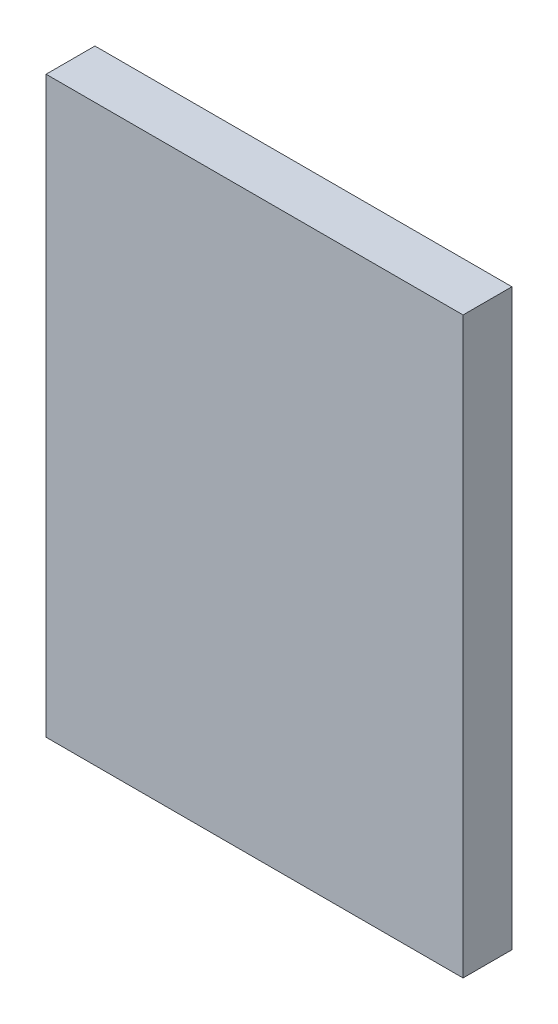
ISO-10303-21;
HEADER;
FILE_DESCRIPTION(('STEP AP214'),'2;1');
FILE_NAME('part.step','',(''),(''),'','','');
FILE_SCHEMA(('AUTOMOTIVE_DESIGN { 1 0 10303 214 1 1 1 1 }'));
ENDSEC;
DATA;
#1=APPLICATION_CONTEXT('core data for automotive mechanical design processes');
#2=APPLICATION_PROTOCOL_DEFINITION('international standard','automotive_design',2000,#1);
#3=PRODUCT_CONTEXT('',#1,'mechanical');
#4=PRODUCT('Part','Part','',(#3));
#5=PRODUCT_RELATED_PRODUCT_CATEGORY('part','',(#4));
#6=PRODUCT_DEFINITION_FORMATION('','',#4);
#7=PRODUCT_DEFINITION_CONTEXT('part definition',#1,'design');
#8=PRODUCT_DEFINITION('design','',#6,#7);
#9=PRODUCT_DEFINITION_SHAPE('','',#8);
#10=(LENGTH_UNIT() NAMED_UNIT(*) SI_UNIT(.MILLI.,.METRE.));
#11=(NAMED_UNIT(*) PLANE_ANGLE_UNIT() SI_UNIT($,.RADIAN.));
#12=(NAMED_UNIT(*) SI_UNIT($,.STERADIAN.) SOLID_ANGLE_UNIT());
#13=UNCERTAINTY_MEASURE_WITH_UNIT(LENGTH_MEASURE(1.E-05),#10,'distance_accuracy_value','');
#14=(GEOMETRIC_REPRESENTATION_CONTEXT(3) GLOBAL_UNCERTAINTY_ASSIGNED_CONTEXT((#13)) GLOBAL_UNIT_ASSIGNED_CONTEXT((#10,
#11,#12)) REPRESENTATION_CONTEXT('',''));
#15=CARTESIAN_POINT('',(0.,0.,0.));
#16=DIRECTION('',(0.,0.,1.));
#17=DIRECTION('',(1.,0.,0.));
#18=AXIS2_PLACEMENT_3D('',#15,#16,#17);
#19=CARTESIAN_POINT('',(-17.5,22.4,-2.));
#20=DIRECTION('',(-1.,0.,0.));
#21=DIRECTION('',(0.,0.,1.));
#22=AXIS2_PLACEMENT_3D('',#19,#20,#21);
#23=PLANE('',#22);
#24=DIRECTION('',(0.,-1.,0.));
#25=VECTOR('',#24,1.);
#26=CARTESIAN_POINT('',(-17.5,22.4,2.1));
#27=LINE('',#26,#25);
#28=CARTESIAN_POINT('',(-17.5,22.4,2.1));
#29=VERTEX_POINT('',#28);
#30=CARTESIAN_POINT('',(-17.5,-25.8,2.1));
#31=VERTEX_POINT('',#30);
#32=EDGE_CURVE('E104',#29,#31,#27,.T.);
#33=ORIENTED_EDGE('',*,*,#32,.F.);
#34=DIRECTION('',(0.,0.,1.));
#35=VECTOR('',#34,1.);
#36=CARTESIAN_POINT('',(-17.5,22.4,-2.));
#37=LINE('',#36,#35);
#38=CARTESIAN_POINT('',(-17.5,22.4,-2.));
#39=VERTEX_POINT('',#38);
#40=EDGE_CURVE('E11',#39,#29,#37,.T.);
#41=ORIENTED_EDGE('',*,*,#40,.F.);
#42=DIRECTION('',(0.,-1.,0.));
#43=VECTOR('',#42,1.);
#44=CARTESIAN_POINT('',(-17.5,22.4,-2.));
#45=LINE('',#44,#43);
#46=CARTESIAN_POINT('',(-17.5,-25.8,-2.));
#47=VERTEX_POINT('',#46);
#48=EDGE_CURVE('E100',#39,#47,#45,.T.);
#49=ORIENTED_EDGE('',*,*,#48,.T.);
#50=DIRECTION('',(0.,0.,1.));
#51=VECTOR('',#50,1.);
#52=CARTESIAN_POINT('',(-17.5,-25.8,-2.));
#53=LINE('',#52,#51);
#54=EDGE_CURVE('E45',#47,#31,#53,.T.);
#55=ORIENTED_EDGE('',*,*,#54,.T.);
#56=EDGE_LOOP('',(#33,#41,#49,#55));
#57=FACE_BOUND('',#56,.T.);
#58=ADVANCED_FACE('F39',(#57),#23,.T.);
#59=CARTESIAN_POINT('',(17.5,22.4,-2.));
#60=DIRECTION('',(0.,1.,0.));
#61=DIRECTION('',(0.,0.,1.));
#62=AXIS2_PLACEMENT_3D('',#59,#60,#61);
#63=PLANE('',#62);
#64=DIRECTION('',(-1.,0.,0.));
#65=VECTOR('',#64,1.);
#66=CARTESIAN_POINT('',(17.5,22.4,2.1));
#67=LINE('',#66,#65);
#68=CARTESIAN_POINT('',(17.5,22.4,2.1));
#69=VERTEX_POINT('',#68);
#70=EDGE_CURVE('E98',#69,#29,#67,.T.);
#71=ORIENTED_EDGE('',*,*,#70,.F.);
#72=DIRECTION('',(0.,0.,1.));
#73=VECTOR('',#72,1.);
#74=CARTESIAN_POINT('',(17.5,22.4,-2.));
#75=LINE('',#74,#73);
#76=CARTESIAN_POINT('',(17.5,22.4,-2.));
#77=VERTEX_POINT('',#76);
#78=EDGE_CURVE('E48',#77,#69,#75,.T.);
#79=ORIENTED_EDGE('',*,*,#78,.F.);
#80=DIRECTION('',(-1.,0.,0.));
#81=VECTOR('',#80,1.);
#82=CARTESIAN_POINT('',(17.5,22.4,-2.));
#83=LINE('',#82,#81);
#84=EDGE_CURVE('E92',#77,#39,#83,.T.);
#85=ORIENTED_EDGE('',*,*,#84,.T.);
#86=ORIENTED_EDGE('',*,*,#40,.T.);
#87=EDGE_LOOP('',(#71,#79,#85,#86));
#88=FACE_BOUND('',#87,.T.);
#89=ADVANCED_FACE('F111',(#88),#63,.T.);
#90=CARTESIAN_POINT('',(17.5,-25.8,-2.));
#91=DIRECTION('',(1.,0.,0.));
#92=DIRECTION('',(0.,0.,-1.));
#93=AXIS2_PLACEMENT_3D('',#90,#91,#92);
#94=PLANE('',#93);
#95=DIRECTION('',(0.,1.,0.));
#96=VECTOR('',#95,1.);
#97=CARTESIAN_POINT('',(17.5,-25.8,2.1));
#98=LINE('',#97,#96);
#99=CARTESIAN_POINT('',(17.5,-25.8,2.1));
#100=VERTEX_POINT('',#99);
#101=EDGE_CURVE('E87',#100,#69,#98,.T.);
#102=ORIENTED_EDGE('',*,*,#101,.F.);
#103=DIRECTION('',(0.,0.,1.));
#104=VECTOR('',#103,1.);
#105=CARTESIAN_POINT('',(17.5,-25.8,-2.));
#106=LINE('',#105,#104);
#107=CARTESIAN_POINT('',(17.5,-25.8,-2.));
#108=VERTEX_POINT('',#107);
#109=EDGE_CURVE('E84',#108,#100,#106,.T.);
#110=ORIENTED_EDGE('',*,*,#109,.F.);
#111=DIRECTION('',(0.,1.,0.));
#112=VECTOR('',#111,1.);
#113=CARTESIAN_POINT('',(17.5,-25.8,-2.));
#114=LINE('',#113,#112);
#115=EDGE_CURVE('E90',#108,#77,#114,.T.);
#116=ORIENTED_EDGE('',*,*,#115,.T.);
#117=ORIENTED_EDGE('',*,*,#78,.T.);
#118=EDGE_LOOP('',(#102,#110,#116,#117));
#119=FACE_BOUND('',#118,.T.);
#120=ADVANCED_FACE('F86',(#119),#94,.T.);
#121=CARTESIAN_POINT('',(-17.5,-25.8,-2.));
#122=DIRECTION('',(0.,-1.,0.));
#123=DIRECTION('',(0.,0.,-1.));
#124=AXIS2_PLACEMENT_3D('',#121,#122,#123);
#125=PLANE('',#124);
#126=DIRECTION('',(1.,0.,0.));
#127=VECTOR('',#126,1.);
#128=CARTESIAN_POINT('',(-17.5,-25.8,2.1));
#129=LINE('',#128,#127);
#130=EDGE_CURVE('E107',#31,#100,#129,.T.);
#131=ORIENTED_EDGE('',*,*,#130,.F.);
#132=ORIENTED_EDGE('',*,*,#54,.F.);
#133=DIRECTION('',(1.,0.,0.));
#134=VECTOR('',#133,1.);
#135=CARTESIAN_POINT('',(-17.5,-25.8,-2.));
#136=LINE('',#135,#134);
#137=EDGE_CURVE('E93',#47,#108,#136,.T.);
#138=ORIENTED_EDGE('',*,*,#137,.T.);
#139=ORIENTED_EDGE('',*,*,#109,.T.);
#140=EDGE_LOOP('',(#131,#132,#138,#139));
#141=FACE_BOUND('',#140,.T.);
#142=ADVANCED_FACE('F96',(#141),#125,.T.);
#143=CARTESIAN_POINT('',(0.,0.,-2.));
#144=DIRECTION('',(0.,0.,1.));
#145=DIRECTION('',(1.,0.,0.));
#146=AXIS2_PLACEMENT_3D('',#143,#144,#145);
#147=PLANE('',#146);
#148=ORIENTED_EDGE('',*,*,#48,.F.);
#149=ORIENTED_EDGE('',*,*,#84,.F.);
#150=ORIENTED_EDGE('',*,*,#115,.F.);
#151=ORIENTED_EDGE('',*,*,#137,.F.);
#152=EDGE_LOOP('',(#148,#149,#150,#151));
#153=FACE_BOUND('',#152,.T.);
#154=ADVANCED_FACE('F95',(#153),#147,.F.);
#155=CARTESIAN_POINT('',(0.,0.,2.1));
#156=DIRECTION('',(0.,0.,1.));
#157=DIRECTION('',(1.,0.,0.));
#158=AXIS2_PLACEMENT_3D('',#155,#156,#157);
#159=PLANE('',#158);
#160=ORIENTED_EDGE('',*,*,#32,.T.);
#161=ORIENTED_EDGE('',*,*,#130,.T.);
#162=ORIENTED_EDGE('',*,*,#101,.T.);
#163=ORIENTED_EDGE('',*,*,#70,.T.);
#164=EDGE_LOOP('',(#160,#161,#162,#163));
#165=FACE_BOUND('',#164,.T.);
#166=ADVANCED_FACE('F115',(#165),#159,.T.);
#167=CLOSED_SHELL('',(#58,#89,#120,#142,#154,#166));
#168=MANIFOLD_SOLID_BREP('B2',#167);
#169=ADVANCED_BREP_SHAPE_REPRESENTATION('',(#18,#168),#14);
#170=SHAPE_DEFINITION_REPRESENTATION(#9,#169);
ENDSEC;
END-ISO-10303-21;
